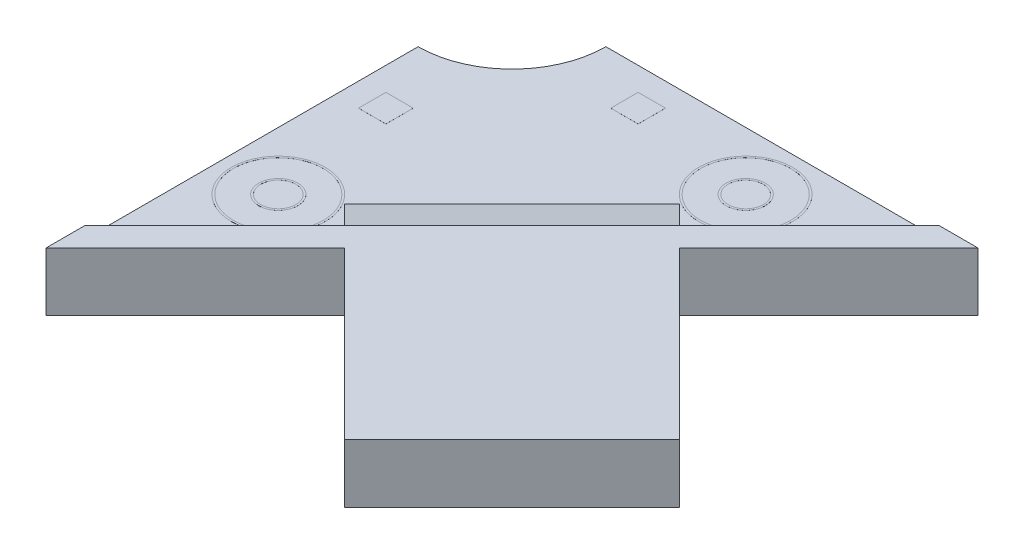
ISO-10303-21;
HEADER;
FILE_DESCRIPTION(('STEP AP214'),'2;1');
FILE_NAME('part.step','',(''),(''),'','','');
FILE_SCHEMA(('AUTOMOTIVE_DESIGN { 1 0 10303 214 1 1 1 1 }'));
ENDSEC;
DATA;
#1=APPLICATION_CONTEXT('core data for automotive mechanical design processes');
#2=APPLICATION_PROTOCOL_DEFINITION('international standard','automotive_design',2000,#1);
#3=PRODUCT_CONTEXT('',#1,'mechanical');
#4=PRODUCT('Part','Part','',(#3));
#5=PRODUCT_RELATED_PRODUCT_CATEGORY('part','',(#4));
#6=PRODUCT_DEFINITION_FORMATION('','',#4);
#7=PRODUCT_DEFINITION_CONTEXT('part definition',#1,'design');
#8=PRODUCT_DEFINITION('design','',#6,#7);
#9=PRODUCT_DEFINITION_SHAPE('','',#8);
#10=(LENGTH_UNIT() NAMED_UNIT(*) SI_UNIT(.MILLI.,.METRE.));
#11=(NAMED_UNIT(*) PLANE_ANGLE_UNIT() SI_UNIT($,.RADIAN.));
#12=(NAMED_UNIT(*) SI_UNIT($,.STERADIAN.) SOLID_ANGLE_UNIT());
#13=UNCERTAINTY_MEASURE_WITH_UNIT(LENGTH_MEASURE(1.E-05),#10,'distance_accuracy_value','');
#14=(GEOMETRIC_REPRESENTATION_CONTEXT(3) GLOBAL_UNCERTAINTY_ASSIGNED_CONTEXT((#13)) GLOBAL_UNIT_ASSIGNED_CONTEXT((#10,
#11,#12)) REPRESENTATION_CONTEXT('',''));
#15=CARTESIAN_POINT('',(0.,0.,0.));
#16=DIRECTION('',(0.,0.,1.));
#17=DIRECTION('',(1.,0.,0.));
#18=AXIS2_PLACEMENT_3D('',#15,#16,#17);
#19=CARTESIAN_POINT('',(0.,152.4,0.));
#20=DIRECTION('',(0.,1.,0.));
#21=DIRECTION('',(0.,0.,1.));
#22=AXIS2_PLACEMENT_3D('',#19,#20,#21);
#23=PLANE('',#22);
#24=DIRECTION('',(0.,0.,1.));
#25=VECTOR('',#24,1.);
#26=CARTESIAN_POINT('',(165.099999999991,152.4,-5.15460690004508E-13));
#27=LINE('',#26,#25);
#28=CARTESIAN_POINT('',(165.099999999992,152.4,485.749570705175));
#29=VERTEX_POINT('',#28);
#30=CARTESIAN_POINT('',(165.099999999993,152.4,574.649570705175));
#31=VERTEX_POINT('',#30);
#32=EDGE_CURVE('E253',#29,#31,#27,.T.);
#33=ORIENTED_EDGE('',*,*,#32,.T.);
#34=DIRECTION('',(-1.,0.,0.));
#35=VECTOR('',#34,1.);
#36=CARTESIAN_POINT('',(2.15294437959904E-12,152.4,574.649570705176));
#37=LINE('',#36,#35);
#38=CARTESIAN_POINT('',(76.1999999999927,152.4,574.649570705175));
#39=VERTEX_POINT('',#38);
#40=EDGE_CURVE('E244',#31,#39,#37,.T.);
#41=ORIENTED_EDGE('',*,*,#40,.T.);
#42=DIRECTION('',(0.,0.,1.));
#43=VECTOR('',#42,1.);
#44=CARTESIAN_POINT('',(76.1999999999905,152.4,-2.85485920617862E-13));
#45=LINE('',#44,#43);
#46=CARTESIAN_POINT('',(76.1999999999923,152.4,485.749570705175));
#47=VERTEX_POINT('',#46);
#48=EDGE_CURVE('E246',#47,#39,#45,.T.);
#49=ORIENTED_EDGE('',*,*,#48,.F.);
#50=DIRECTION('',(-1.,0.,0.));
#51=VECTOR('',#50,1.);
#52=CARTESIAN_POINT('',(2.42650329628199E-12,152.4,485.749570705176));
#53=LINE('',#52,#51);
#54=EDGE_CURVE('E250',#29,#47,#53,.T.);
#55=ORIENTED_EDGE('',*,*,#54,.F.);
#56=EDGE_LOOP('',(#33,#41,#49,#55));
#57=FACE_BOUND('',#56,.T.);
#58=CARTESIAN_POINT('',(188.585378542446,152.4,947.417020772786));
#59=DIRECTION('',(0.,1.,0.));
#60=DIRECTION('',(0.,0.,1.));
#61=AXIS2_PLACEMENT_3D('',#58,#59,#60);
#62=CIRCLE('',#61,152.4);
#63=CARTESIAN_POINT('',(188.585378542446,152.4,1099.81702077279));
#64=VERTEX_POINT('',#63);
#65=EDGE_CURVE('E67',#64,#64,#62,.T.);
#66=ORIENTED_EDGE('',*,*,#65,.F.);
#67=EDGE_LOOP('',(#66));
#68=FACE_BOUND('',#67,.T.);
#69=CARTESIAN_POINT('',(947.417020772787,152.4,188.585378542443));
#70=DIRECTION('',(0.,1.,0.));
#71=DIRECTION('',(0.,0.,1.));
#72=AXIS2_PLACEMENT_3D('',#69,#70,#71);
#73=CIRCLE('',#72,152.400000000001);
#74=CARTESIAN_POINT('',(947.417020772787,152.4,340.985378542443));
#75=VERTEX_POINT('',#74);
#76=EDGE_CURVE('E285',#75,#75,#73,.T.);
#77=ORIENTED_EDGE('',*,*,#76,.F.);
#78=EDGE_LOOP('',(#77));
#79=FACE_BOUND('',#78,.T.);
#80=DIRECTION('',(0.707106781186548,0.,0.707106781186547));
#81=VECTOR('',#80,1.);
#82=CARTESIAN_POINT('',(866.594715683168,152.4,323.289220358482));
#83=LINE('',#82,#81);
#84=CARTESIAN_POINT('',(866.594715683168,152.4,323.289220358482));
#85=VERTEX_POINT('',#84);
#86=CARTESIAN_POINT('',(965.377533014928,152.4,422.072037690242));
#87=VERTEX_POINT('',#86);
#88=EDGE_CURVE('E306',#85,#87,#83,.T.);
#89=ORIENTED_EDGE('',*,*,#88,.T.);
#90=DIRECTION('',(-0.707106781186546,0.,0.707106781186549));
#91=VECTOR('',#90,1.);
#92=CARTESIAN_POINT('',(1387.44957070518,152.4,-1.05178150895727E-11));
#93=LINE('',#92,#91);
#94=CARTESIAN_POINT('',(1387.44957070518,152.4,-9.6406466049164E-12));
#95=VERTEX_POINT('',#94);
#96=EDGE_CURVE('E348',#95,#87,#93,.T.);
#97=ORIENTED_EDGE('',*,*,#96,.F.);
#98=DIRECTION('',(-1.,0.,0.));
#99=VECTOR('',#98,1.);
#100=CARTESIAN_POINT('',(1513.17315640014,152.4,-1.05182352380585E-11));
#101=LINE('',#100,#99);
#102=CARTESIAN_POINT('',(304.8,152.4,-1.08628629570571E-11));
#103=VERTEX_POINT('',#102);
#104=EDGE_CURVE('E378',#95,#103,#101,.T.);
#105=ORIENTED_EDGE('',*,*,#104,.T.);
#106=CARTESIAN_POINT('',(0.,152.4,0.));
#107=DIRECTION('',(0.,1.,0.));
#108=DIRECTION('',(0.,0.,-1.));
#109=AXIS2_PLACEMENT_3D('',#106,#107,#108);
#110=CIRCLE('',#109,304.8);
#111=CARTESIAN_POINT('',(0.,152.4,304.8));
#112=VERTEX_POINT('',#111);
#113=EDGE_CURVE('E366',#112,#103,#110,.T.);
#114=ORIENTED_EDGE('',*,*,#113,.F.);
#115=DIRECTION('',(0.,0.,1.));
#116=VECTOR('',#115,1.);
#117=CARTESIAN_POINT('',(0.,152.4,0.));
#118=LINE('',#117,#116);
#119=CARTESIAN_POINT('',(0.,152.4,1387.44957070517));
#120=VERTEX_POINT('',#119);
#121=EDGE_CURVE('E380',#112,#120,#118,.T.);
#122=ORIENTED_EDGE('',*,*,#121,.T.);
#123=CARTESIAN_POINT('',(422.072037690245,152.4,965.377533014926));
#124=VERTEX_POINT('',#123);
#125=EDGE_CURVE('E343',#124,#120,#93,.T.);
#126=ORIENTED_EDGE('',*,*,#125,.F.);
#127=DIRECTION('',(0.707106781186548,0.,0.707106781186547));
#128=VECTOR('',#127,1.);
#129=CARTESIAN_POINT('',(323.289220358484,152.4,866.594715683165));
#130=LINE('',#129,#128);
#131=CARTESIAN_POINT('',(323.289220358484,152.4,866.594715683165));
#132=VERTEX_POINT('',#131);
#133=EDGE_CURVE('E304',#132,#124,#130,.T.);
#134=ORIENTED_EDGE('',*,*,#133,.F.);
#135=DIRECTION('',(-0.707106781186548,0.,0.707106781186548));
#136=VECTOR('',#135,1.);
#137=CARTESIAN_POINT('',(866.594715683168,152.4,323.289220358482));
#138=LINE('',#137,#136);
#139=EDGE_CURVE('E315',#85,#132,#138,.T.);
#140=ORIENTED_EDGE('',*,*,#139,.F.);
#141=EDGE_LOOP('',(#89,#97,#105,#114,#122,#126,#134,#140));
#142=FACE_BOUND('',#141,.T.);
#143=DIRECTION('',(0.,0.,-1.));
#144=VECTOR('',#143,1.);
#145=CARTESIAN_POINT('',(574.649570705175,152.4,-7.17648126533012E-13));
#146=LINE('',#145,#144);
#147=CARTESIAN_POINT('',(574.649570705176,152.4,165.09999999999));
#148=VERTEX_POINT('',#147);
#149=CARTESIAN_POINT('',(574.649570705176,152.4,76.1999999999903));
#150=VERTEX_POINT('',#149);
#151=EDGE_CURVE('E74',#148,#150,#146,.T.);
#152=ORIENTED_EDGE('',*,*,#151,.F.);
#153=DIRECTION('',(1.,0.,0.));
#154=VECTOR('',#153,1.);
#155=CARTESIAN_POINT('',(0.,152.4,165.09999999999));
#156=LINE('',#155,#154);
#157=CARTESIAN_POINT('',(485.749570705176,152.4,165.09999999999));
#158=VERTEX_POINT('',#157);
#159=EDGE_CURVE('E199',#158,#148,#156,.T.);
#160=ORIENTED_EDGE('',*,*,#159,.F.);
#161=DIRECTION('',(0.,0.,-1.));
#162=VECTOR('',#161,1.);
#163=CARTESIAN_POINT('',(485.749570705176,152.4,3.03312912035248E-13));
#164=LINE('',#163,#162);
#165=CARTESIAN_POINT('',(485.749570705176,152.4,76.1999999999903));
#166=VERTEX_POINT('',#165);
#167=EDGE_CURVE('E202',#158,#166,#164,.T.);
#168=ORIENTED_EDGE('',*,*,#167,.T.);
#169=DIRECTION('',(1.,0.,0.));
#170=VECTOR('',#169,1.);
#171=CARTESIAN_POINT('',(0.,152.4,76.1999999999903));
#172=LINE('',#171,#170);
#173=EDGE_CURVE('E79',#166,#150,#172,.T.);
#174=ORIENTED_EDGE('',*,*,#173,.T.);
#175=EDGE_LOOP('',(#152,#160,#168,#174));
#176=FACE_BOUND('',#175,.T.);
#177=ADVANCED_FACE('F59',(#57,#68,#79,#142,#176),#23,.T.);
#178=CARTESIAN_POINT('',(1387.44957070518,190.5,-1.05178150895727E-11));
#179=DIRECTION('',(0.707106781186549,0.,0.707106781186546));
#180=DIRECTION('',(0.707106781186546,0.,-0.707106781186549));
#181=AXIS2_PLACEMENT_3D('',#178,#179,#180);
#182=PLANE('',#181);
#183=DIRECTION('',(0.,1.,0.));
#184=VECTOR('',#183,1.);
#185=CARTESIAN_POINT('',(422.072037690245,152.4,965.377533014926));
#186=LINE('',#185,#184);
#187=CARTESIAN_POINT('',(422.072037690244,190.5,965.377533014925));
#188=VERTEX_POINT('',#187);
#189=EDGE_CURVE('E297',#124,#188,#186,.T.);
#190=ORIENTED_EDGE('',*,*,#189,.F.);
#191=ORIENTED_EDGE('',*,*,#125,.T.);
#192=DIRECTION('',(0.,-1.,0.));
#193=VECTOR('',#192,1.);
#194=CARTESIAN_POINT('',(0.,190.5,1387.44957070517));
#195=LINE('',#194,#193);
#196=CARTESIAN_POINT('',(0.,190.5,1387.44957070517));
#197=VERTEX_POINT('',#196);
#198=EDGE_CURVE('E358',#197,#120,#195,.T.);
#199=ORIENTED_EDGE('',*,*,#198,.F.);
#200=DIRECTION('',(-0.707106781186546,0.,0.707106781186549));
#201=VECTOR('',#200,1.);
#202=CARTESIAN_POINT('',(1387.44957070518,190.5,-1.05178150895727E-11));
#203=LINE('',#202,#201);
#204=EDGE_CURVE('E354',#188,#197,#203,.T.);
#205=ORIENTED_EDGE('',*,*,#204,.F.);
#206=EDGE_LOOP('',(#190,#191,#199,#205));
#207=FACE_BOUND('',#206,.T.);
#208=ADVANCED_FACE('F409',(#207),#182,.F.);
#209=CARTESIAN_POINT('',(-5.28321583800946E-12,152.4,1513.17315640014));
#210=DIRECTION('',(-0.707106781186549,0.,-0.707106781186546));
#211=DIRECTION('',(-0.707106781186546,0.,0.707106781186549));
#212=AXIS2_PLACEMENT_3D('',#209,#210,#211);
#213=PLANE('',#212);
#214=DIRECTION('',(0.,-1.,0.));
#215=VECTOR('',#214,1.);
#216=CARTESIAN_POINT('',(1028.23932586241,190.5,484.933830537726));
#217=LINE('',#216,#215);
#218=CARTESIAN_POINT('',(1028.23932586241,190.5,484.933830537725));
#219=VERTEX_POINT('',#218);
#220=CARTESIAN_POINT('',(1028.23932586241,0.,484.933830537726));
#221=VERTEX_POINT('',#220);
#222=EDGE_CURVE('E340',#219,#221,#217,.T.);
#223=ORIENTED_EDGE('',*,*,#222,.T.);
#224=DIRECTION('',(0.707106781186546,0.,-0.707106781186549));
#225=VECTOR('',#224,1.);
#226=CARTESIAN_POINT('',(-5.28321583800946E-12,0.,1513.17315640014));
#227=LINE('',#226,#225);
#228=CARTESIAN_POINT('',(1513.17315640014,0.,-1.05182352380585E-11));
#229=VERTEX_POINT('',#228);
#230=EDGE_CURVE('E389',#221,#229,#227,.T.);
#231=ORIENTED_EDGE('',*,*,#230,.T.);
#232=DIRECTION('',(0.,-1.,0.));
#233=VECTOR('',#232,1.);
#234=CARTESIAN_POINT('',(1513.17315640014,152.4,-1.05182352380585E-11));
#235=LINE('',#234,#233);
#236=CARTESIAN_POINT('',(1513.17315640014,190.5,-1.05182352380585E-11));
#237=VERTEX_POINT('',#236);
#238=EDGE_CURVE('E384',#237,#229,#235,.T.);
#239=ORIENTED_EDGE('',*,*,#238,.F.);
#240=DIRECTION('',(0.707106781186546,0.,-0.707106781186549));
#241=VECTOR('',#240,1.);
#242=CARTESIAN_POINT('',(-5.28321583800946E-12,190.5,1513.17315640014));
#243=LINE('',#242,#241);
#244=EDGE_CURVE('E347',#219,#237,#243,.T.);
#245=ORIENTED_EDGE('',*,*,#244,.F.);
#246=EDGE_LOOP('',(#223,#231,#239,#245));
#247=FACE_BOUND('',#246,.T.);
#248=ADVANCED_FACE('F492',(#247),#213,.F.);
#249=DIRECTION('',(0.,-1.,0.));
#250=VECTOR('',#249,1.);
#251=CARTESIAN_POINT('',(484.933830537729,190.5,1028.23932586241));
#252=LINE('',#251,#250);
#253=CARTESIAN_POINT('',(484.933830537729,190.5,1028.23932586241));
#254=VERTEX_POINT('',#253);
#255=CARTESIAN_POINT('',(484.933830537729,0.,1028.23932586241));
#256=VERTEX_POINT('',#255);
#257=EDGE_CURVE('E338',#254,#256,#252,.T.);
#258=ORIENTED_EDGE('',*,*,#257,.F.);
#259=CARTESIAN_POINT('',(-5.28321583800946E-12,190.5,1513.17315640014));
#260=VERTEX_POINT('',#259);
#261=EDGE_CURVE('E349',#260,#254,#243,.T.);
#262=ORIENTED_EDGE('',*,*,#261,.F.);
#263=DIRECTION('',(0.,-1.,0.));
#264=VECTOR('',#263,1.);
#265=CARTESIAN_POINT('',(-5.28321583800946E-12,152.4,1513.17315640014));
#266=LINE('',#265,#264);
#267=CARTESIAN_POINT('',(-5.28321583800946E-12,0.,1513.17315640014));
#268=VERTEX_POINT('',#267);
#269=EDGE_CURVE('E394',#260,#268,#266,.T.);
#270=ORIENTED_EDGE('',*,*,#269,.T.);
#271=EDGE_CURVE('E381',#268,#256,#227,.T.);
#272=ORIENTED_EDGE('',*,*,#271,.T.);
#273=EDGE_LOOP('',(#258,#262,#270,#272));
#274=FACE_BOUND('',#273,.T.);
#275=ADVANCED_FACE('F444',(#274),#213,.F.);
#276=CARTESIAN_POINT('',(1513.17315640014,152.4,-1.05182352380585E-11));
#277=DIRECTION('',(0.,0.,1.));
#278=DIRECTION('',(1.,0.,0.));
#279=AXIS2_PLACEMENT_3D('',#276,#277,#278);
#280=PLANE('',#279);
#281=DIRECTION('',(-1.,0.,0.));
#282=VECTOR('',#281,1.);
#283=CARTESIAN_POINT('',(1513.17315640014,0.,-1.05182352380585E-11));
#284=LINE('',#283,#282);
#285=CARTESIAN_POINT('',(304.8,0.,-2.11869876689278E-12));
#286=VERTEX_POINT('',#285);
#287=EDGE_CURVE('E376',#229,#286,#284,.T.);
#288=ORIENTED_EDGE('',*,*,#287,.T.);
#289=DIRECTION('',(0.,1.,0.));
#290=VECTOR('',#289,1.);
#291=CARTESIAN_POINT('',(304.8,0.,-1.08628629570571E-11));
#292=LINE('',#291,#290);
#293=EDGE_CURVE('E373',#286,#103,#292,.T.);
#294=ORIENTED_EDGE('',*,*,#293,.T.);
#295=ORIENTED_EDGE('',*,*,#104,.F.);
#296=DIRECTION('',(0.,-1.,0.));
#297=VECTOR('',#296,1.);
#298=CARTESIAN_POINT('',(1387.44957070518,190.5,-1.05178150895727E-11));
#299=LINE('',#298,#297);
#300=CARTESIAN_POINT('',(1387.44957070518,190.5,-1.05178150895727E-11));
#301=VERTEX_POINT('',#300);
#302=EDGE_CURVE('E363',#301,#95,#299,.T.);
#303=ORIENTED_EDGE('',*,*,#302,.F.);
#304=DIRECTION('',(-1.,0.,0.));
#305=VECTOR('',#304,1.);
#306=CARTESIAN_POINT('',(1387.44957070518,190.5,-1.05178150895727E-11));
#307=LINE('',#306,#305);
#308=EDGE_CURVE('E352',#237,#301,#307,.T.);
#309=ORIENTED_EDGE('',*,*,#308,.F.);
#310=ORIENTED_EDGE('',*,*,#238,.T.);
#311=EDGE_LOOP('',(#288,#294,#295,#303,#309,#310));
#312=FACE_BOUND('',#311,.T.);
#313=ADVANCED_FACE('F61',(#312),#280,.F.);
#314=CARTESIAN_POINT('',(0.,152.4,0.));
#315=DIRECTION('',(1.,0.,0.));
#316=DIRECTION('',(0.,0.,-1.));
#317=AXIS2_PLACEMENT_3D('',#314,#315,#316);
#318=PLANE('',#317);
#319=ORIENTED_EDGE('',*,*,#121,.F.);
#320=DIRECTION('',(0.,1.,0.));
#321=VECTOR('',#320,1.);
#322=CARTESIAN_POINT('',(0.,0.,304.8));
#323=LINE('',#322,#321);
#324=CARTESIAN_POINT('',(0.,0.,304.8));
#325=VERTEX_POINT('',#324);
#326=EDGE_CURVE('E370',#325,#112,#323,.T.);
#327=ORIENTED_EDGE('',*,*,#326,.F.);
#328=DIRECTION('',(0.,0.,1.));
#329=VECTOR('',#328,1.);
#330=CARTESIAN_POINT('',(0.,0.,0.));
#331=LINE('',#330,#329);
#332=EDGE_CURVE('E387',#325,#268,#331,.T.);
#333=ORIENTED_EDGE('',*,*,#332,.T.);
#334=ORIENTED_EDGE('',*,*,#269,.F.);
#335=DIRECTION('',(0.,0.,1.));
#336=VECTOR('',#335,1.);
#337=CARTESIAN_POINT('',(0.,190.5,1387.44957070517));
#338=LINE('',#337,#336);
#339=EDGE_CURVE('E344',#197,#260,#338,.T.);
#340=ORIENTED_EDGE('',*,*,#339,.F.);
#341=ORIENTED_EDGE('',*,*,#198,.T.);
#342=EDGE_LOOP('',(#319,#327,#333,#334,#340,#341));
#343=FACE_BOUND('',#342,.T.);
#344=ADVANCED_FACE('F435',(#343),#318,.F.);
#345=CARTESIAN_POINT('',(0.,0.,0.));
#346=DIRECTION('',(0.,1.,0.));
#347=DIRECTION('',(0.,0.,1.));
#348=AXIS2_PLACEMENT_3D('',#345,#346,#347);
#349=PLANE('',#348);
#350=ORIENTED_EDGE('',*,*,#332,.F.);
#351=CARTESIAN_POINT('',(0.,0.,0.));
#352=DIRECTION('',(0.,1.,0.));
#353=DIRECTION('',(0.,0.,-1.));
#354=AXIS2_PLACEMENT_3D('',#351,#352,#353);
#355=CIRCLE('',#354,304.8);
#356=EDGE_CURVE('E367',#325,#286,#355,.T.);
#357=ORIENTED_EDGE('',*,*,#356,.T.);
#358=ORIENTED_EDGE('',*,*,#287,.F.);
#359=ORIENTED_EDGE('',*,*,#230,.F.);
#360=DIRECTION('',(-0.707106781186552,0.,-0.707106781186543));
#361=VECTOR('',#360,1.);
#362=CARTESIAN_POINT('',(1567.05469312657,0.,1023.74919780187));
#363=LINE('',#362,#361);
#364=CARTESIAN_POINT('',(1567.05469312657,0.,1023.74919780187));
#365=VERTEX_POINT('',#364);
#366=EDGE_CURVE('E317',#365,#221,#363,.T.);
#367=ORIENTED_EDGE('',*,*,#366,.F.);
#368=DIRECTION('',(0.707106781186547,0.,-0.707106781186548));
#369=VECTOR('',#368,1.);
#370=CARTESIAN_POINT('',(1023.74919780188,0.,1567.05469312656));
#371=LINE('',#370,#369);
#372=CARTESIAN_POINT('',(1023.74919780188,0.,1567.05469312656));
#373=VERTEX_POINT('',#372);
#374=EDGE_CURVE('E324',#373,#365,#371,.T.);
#375=ORIENTED_EDGE('',*,*,#374,.F.);
#376=DIRECTION('',(0.707106781186548,0.,0.707106781186547));
#377=VECTOR('',#376,1.);
#378=CARTESIAN_POINT('',(484.933830537729,0.,1028.23932586241));
#379=LINE('',#378,#377);
#380=EDGE_CURVE('E330',#256,#373,#379,.T.);
#381=ORIENTED_EDGE('',*,*,#380,.F.);
#382=ORIENTED_EDGE('',*,*,#271,.F.);
#383=EDGE_LOOP('',(#350,#357,#358,#359,#367,#375,#381,#382));
#384=FACE_BOUND('',#383,.T.);
#385=ADVANCED_FACE('F438',(#384),#349,.F.);
#386=CARTESIAN_POINT('',(0.,0.,0.));
#387=DIRECTION('',(0.,1.,0.));
#388=DIRECTION('',(0.,0.,1.));
#389=AXIS2_PLACEMENT_3D('',#386,#387,#388);
#390=CYLINDRICAL_SURFACE('',#389,304.8);
#391=ORIENTED_EDGE('',*,*,#113,.T.);
#392=ORIENTED_EDGE('',*,*,#293,.F.);
#393=ORIENTED_EDGE('',*,*,#356,.F.);
#394=ORIENTED_EDGE('',*,*,#326,.T.);
#395=EDGE_LOOP('',(#391,#392,#393,#394));
#396=FACE_BOUND('',#395,.T.);
#397=ADVANCED_FACE('F431',(#396),#390,.F.);
#398=ORIENTED_EDGE('',*,*,#96,.T.);
#399=DIRECTION('',(0.,1.,0.));
#400=VECTOR('',#399,1.);
#401=CARTESIAN_POINT('',(965.377533014928,152.4,422.072037690242));
#402=LINE('',#401,#400);
#403=CARTESIAN_POINT('',(965.377533014928,190.5,422.072037690242));
#404=VERTEX_POINT('',#403);
#405=EDGE_CURVE('E300',#87,#404,#402,.T.);
#406=ORIENTED_EDGE('',*,*,#405,.T.);
#407=EDGE_CURVE('E355',#301,#404,#203,.T.);
#408=ORIENTED_EDGE('',*,*,#407,.F.);
#409=ORIENTED_EDGE('',*,*,#302,.T.);
#410=EDGE_LOOP('',(#398,#406,#408,#409));
#411=FACE_BOUND('',#410,.T.);
#412=ADVANCED_FACE('F423',(#411),#182,.F.);
#413=CARTESIAN_POINT('',(0.,190.5,0.));
#414=DIRECTION('',(0.,1.,0.));
#415=DIRECTION('',(0.,0.,1.));
#416=AXIS2_PLACEMENT_3D('',#413,#414,#415);
#417=PLANE('',#416);
#418=ORIENTED_EDGE('',*,*,#339,.T.);
#419=ORIENTED_EDGE('',*,*,#261,.T.);
#420=DIRECTION('',(0.707106781186548,0.,0.707106781186547));
#421=VECTOR('',#420,1.);
#422=CARTESIAN_POINT('',(484.933830537729,190.5,1028.23932586241));
#423=LINE('',#422,#421);
#424=CARTESIAN_POINT('',(1023.74919780188,190.5,1567.05469312656));
#425=VERTEX_POINT('',#424);
#426=EDGE_CURVE('E323',#254,#425,#423,.T.);
#427=ORIENTED_EDGE('',*,*,#426,.T.);
#428=DIRECTION('',(0.707106781186547,0.,-0.707106781186548));
#429=VECTOR('',#428,1.);
#430=CARTESIAN_POINT('',(1023.74919780188,190.5,1567.05469312656));
#431=LINE('',#430,#429);
#432=CARTESIAN_POINT('',(1567.05469312657,190.5,1023.74919780187));
#433=VERTEX_POINT('',#432);
#434=EDGE_CURVE('E326',#425,#433,#431,.T.);
#435=ORIENTED_EDGE('',*,*,#434,.T.);
#436=DIRECTION('',(-0.707106781186552,0.,-0.707106781186543));
#437=VECTOR('',#436,1.);
#438=CARTESIAN_POINT('',(1567.05469312657,190.5,1023.74919780187));
#439=LINE('',#438,#437);
#440=EDGE_CURVE('E320',#433,#219,#439,.T.);
#441=ORIENTED_EDGE('',*,*,#440,.T.);
#442=ORIENTED_EDGE('',*,*,#244,.T.);
#443=ORIENTED_EDGE('',*,*,#308,.T.);
#444=ORIENTED_EDGE('',*,*,#407,.T.);
#445=DIRECTION('',(-0.707106781186548,0.,0.707106781186548));
#446=VECTOR('',#445,1.);
#447=CARTESIAN_POINT('',(965.377533014928,190.5,422.072037690242));
#448=LINE('',#447,#446);
#449=EDGE_CURVE('E309',#404,#188,#448,.T.);
#450=ORIENTED_EDGE('',*,*,#449,.T.);
#451=ORIENTED_EDGE('',*,*,#204,.T.);
#452=EDGE_LOOP('',(#418,#419,#427,#435,#441,#442,#443,#444,#450,#451));
#453=FACE_BOUND('',#452,.T.);
#454=ADVANCED_FACE('F449',(#453),#417,.T.);
#455=CARTESIAN_POINT('',(1567.05469312657,190.5,1023.74919780187));
#456=DIRECTION('',(-0.707106781186543,0.,0.707106781186552));
#457=DIRECTION('',(0.707106781186552,0.,0.707106781186543));
#458=AXIS2_PLACEMENT_3D('',#455,#456,#457);
#459=PLANE('',#458);
#460=ORIENTED_EDGE('',*,*,#366,.T.);
#461=ORIENTED_EDGE('',*,*,#222,.F.);
#462=ORIENTED_EDGE('',*,*,#440,.F.);
#463=DIRECTION('',(0.,-1.,0.));
#464=VECTOR('',#463,1.);
#465=CARTESIAN_POINT('',(1567.05469312657,190.5,1023.74919780187));
#466=LINE('',#465,#464);
#467=EDGE_CURVE('E328',#433,#365,#466,.T.);
#468=ORIENTED_EDGE('',*,*,#467,.T.);
#469=EDGE_LOOP('',(#460,#461,#462,#468));
#470=FACE_BOUND('',#469,.T.);
#471=ADVANCED_FACE('F479',(#470),#459,.F.);
#472=CARTESIAN_POINT('',(484.933830537729,190.5,1028.23932586241));
#473=DIRECTION('',(0.707106781186547,0.,-0.707106781186548));
#474=DIRECTION('',(-0.707106781186548,0.,-0.707106781186547));
#475=AXIS2_PLACEMENT_3D('',#472,#473,#474);
#476=PLANE('',#475);
#477=ORIENTED_EDGE('',*,*,#380,.T.);
#478=DIRECTION('',(0.,-1.,0.));
#479=VECTOR('',#478,1.);
#480=CARTESIAN_POINT('',(1023.74919780188,190.5,1567.05469312656));
#481=LINE('',#480,#479);
#482=EDGE_CURVE('E335',#425,#373,#481,.T.);
#483=ORIENTED_EDGE('',*,*,#482,.F.);
#484=ORIENTED_EDGE('',*,*,#426,.F.);
#485=ORIENTED_EDGE('',*,*,#257,.T.);
#486=EDGE_LOOP('',(#477,#483,#484,#485));
#487=FACE_BOUND('',#486,.T.);
#488=ADVANCED_FACE('F475',(#487),#476,.F.);
#489=CARTESIAN_POINT('',(1023.74919780188,190.5,1567.05469312656));
#490=DIRECTION('',(-0.707106781186548,0.,-0.707106781186547));
#491=DIRECTION('',(-0.707106781186547,0.,0.707106781186548));
#492=AXIS2_PLACEMENT_3D('',#489,#490,#491);
#493=PLANE('',#492);
#494=ORIENTED_EDGE('',*,*,#374,.T.);
#495=ORIENTED_EDGE('',*,*,#467,.F.);
#496=ORIENTED_EDGE('',*,*,#434,.F.);
#497=ORIENTED_EDGE('',*,*,#482,.T.);
#498=EDGE_LOOP('',(#494,#495,#496,#497));
#499=FACE_BOUND('',#498,.T.);
#500=ADVANCED_FACE('F468',(#499),#493,.F.);
#501=CARTESIAN_POINT('',(965.377533014928,190.5,422.072037690242));
#502=DIRECTION('',(-0.186052101883813,0.964763821237732,-0.186052101883813));
#503=DIRECTION('',(0.,0.189358320929341,0.981908053890394));
#504=AXIS2_PLACEMENT_3D('',#501,#502,#503);
#505=PLANE('',#504);
#506=DIRECTION('',(-0.682191040240647,-0.263117405792109,-0.682191040240646));
#507=VECTOR('',#506,1.);
#508=CARTESIAN_POINT('',(422.072037690245,190.5,965.377533014926));
#509=LINE('',#508,#507);
#510=EDGE_CURVE('E311',#188,#132,#509,.T.);
#511=ORIENTED_EDGE('',*,*,#510,.F.);
#512=ORIENTED_EDGE('',*,*,#449,.F.);
#513=DIRECTION('',(-0.682191040240647,-0.263117405792109,-0.682191040240646));
#514=VECTOR('',#513,1.);
#515=CARTESIAN_POINT('',(965.377533014928,190.5,422.072037690242));
#516=LINE('',#515,#514);
#517=EDGE_CURVE('E303',#404,#85,#516,.T.);
#518=ORIENTED_EDGE('',*,*,#517,.T.);
#519=ORIENTED_EDGE('',*,*,#139,.T.);
#520=EDGE_LOOP('',(#511,#512,#518,#519));
#521=FACE_BOUND('',#520,.T.);
#522=ADVANCED_FACE('F458',(#521),#505,.T.);
#523=CARTESIAN_POINT('',(271.652747662343,0.,-271.652747662343));
#524=DIRECTION('',(0.707106781186547,0.,-0.707106781186548));
#525=DIRECTION('',(-0.707106781186548,0.,-0.707106781186547));
#526=AXIS2_PLACEMENT_3D('',#523,#524,#525);
#527=PLANE('',#526);
#528=ORIENTED_EDGE('',*,*,#405,.F.);
#529=ORIENTED_EDGE('',*,*,#88,.F.);
#530=ORIENTED_EDGE('',*,*,#517,.F.);
#531=EDGE_LOOP('',(#528,#529,#530));
#532=FACE_BOUND('',#531,.T.);
#533=ADVANCED_FACE('F459',(#532),#527,.T.);
#534=CARTESIAN_POINT('',(-271.652747662341,0.,271.652747662341));
#535=DIRECTION('',(0.707106781186547,0.,-0.707106781186548));
#536=DIRECTION('',(-0.707106781186548,0.,-0.707106781186547));
#537=AXIS2_PLACEMENT_3D('',#534,#535,#536);
#538=PLANE('',#537);
#539=ORIENTED_EDGE('',*,*,#189,.T.);
#540=ORIENTED_EDGE('',*,*,#510,.T.);
#541=ORIENTED_EDGE('',*,*,#133,.T.);
#542=EDGE_LOOP('',(#539,#540,#541));
#543=FACE_BOUND('',#542,.T.);
#544=ADVANCED_FACE('F455',(#543),#538,.F.);
#545=CARTESIAN_POINT('',(947.417020772787,152.527,188.585378542443));
#546=DIRECTION('',(0.,-1.,0.));
#547=DIRECTION('',(0.,0.,-1.));
#548=AXIS2_PLACEMENT_3D('',#545,#546,#547);
#549=CYLINDRICAL_SURFACE('',#548,146.049999999999);
#550=CARTESIAN_POINT('',(947.417020772787,152.527,188.585378542443));
#551=DIRECTION('',(0.,1.,0.));
#552=DIRECTION('',(0.,0.,1.));
#553=AXIS2_PLACEMENT_3D('',#550,#551,#552);
#554=CIRCLE('',#553,146.049999999999);
#555=CARTESIAN_POINT('',(947.417020772787,152.527,334.635378542442));
#556=VERTEX_POINT('',#555);
#557=EDGE_CURVE('E291',#556,#556,#554,.T.);
#558=ORIENTED_EDGE('',*,*,#557,.T.);
#559=EDGE_LOOP('',(#558));
#560=FACE_BOUND('',#559,.T.);
#561=CARTESIAN_POINT('',(947.417020772787,152.4,188.585378542443));
#562=DIRECTION('',(0.,1.,0.));
#563=DIRECTION('',(0.,0.,1.));
#564=AXIS2_PLACEMENT_3D('',#561,#562,#563);
#565=CIRCLE('',#564,146.049999999999);
#566=CARTESIAN_POINT('',(947.417020772787,152.4,334.635378542442));
#567=VERTEX_POINT('',#566);
#568=EDGE_CURVE('E397',#567,#567,#565,.F.);
#569=ORIENTED_EDGE('',*,*,#568,.T.);
#570=EDGE_LOOP('',(#569));
#571=FACE_BOUND('',#570,.T.);
#572=ADVANCED_FACE('F466',(#560,#571),#549,.F.);
#573=CARTESIAN_POINT('',(947.417020772787,152.527,188.585378542443));
#574=DIRECTION('',(0.,-1.,0.));
#575=DIRECTION('',(0.,0.,-1.));
#576=AXIS2_PLACEMENT_3D('',#573,#574,#575);
#577=CYLINDRICAL_SURFACE('',#576,152.400000000001);
#578=CARTESIAN_POINT('',(947.417020772787,152.527,188.585378542443));
#579=DIRECTION('',(0.,1.,0.));
#580=DIRECTION('',(0.,0.,1.));
#581=AXIS2_PLACEMENT_3D('',#578,#579,#580);
#582=CIRCLE('',#581,152.400000000001);
#583=CARTESIAN_POINT('',(947.417020772787,152.527,340.985378542443));
#584=VERTEX_POINT('',#583);
#585=EDGE_CURVE('E294',#584,#584,#582,.T.);
#586=ORIENTED_EDGE('',*,*,#585,.F.);
#587=EDGE_LOOP('',(#586));
#588=FACE_BOUND('',#587,.T.);
#589=ORIENTED_EDGE('',*,*,#76,.T.);
#590=EDGE_LOOP('',(#589));
#591=FACE_BOUND('',#590,.T.);
#592=ADVANCED_FACE('F610',(#588,#591),#577,.T.);
#593=CARTESIAN_POINT('',(0.,152.527,0.));
#594=DIRECTION('',(0.,1.,0.));
#595=DIRECTION('',(0.,0.,1.));
#596=AXIS2_PLACEMENT_3D('',#593,#594,#595);
#597=PLANE('',#596);
#598=ORIENTED_EDGE('',*,*,#557,.F.);
#599=EDGE_LOOP('',(#598));
#600=FACE_BOUND('',#599,.T.);
#601=ORIENTED_EDGE('',*,*,#585,.T.);
#602=EDGE_LOOP('',(#601));
#603=FACE_BOUND('',#602,.T.);
#604=ADVANCED_FACE('F565',(#600,#603),#597,.T.);
#605=CARTESIAN_POINT('',(947.417020772787,152.4,188.585378542443));
#606=DIRECTION('',(0.,1.,0.));
#607=DIRECTION('',(0.,0.,1.));
#608=AXIS2_PLACEMENT_3D('',#605,#606,#607);
#609=CIRCLE('',#608,63.4999999999999);
#610=CARTESIAN_POINT('',(947.417020772787,152.4,252.085378542442));
#611=VERTEX_POINT('',#610);
#612=EDGE_CURVE('E282',#611,#611,#609,.T.);
#613=ORIENTED_EDGE('',*,*,#612,.F.);
#614=EDGE_LOOP('',(#613));
#615=FACE_BOUND('',#614,.T.);
#616=ORIENTED_EDGE('',*,*,#568,.F.);
#617=EDGE_LOOP('',(#616));
#618=FACE_BOUND('',#617,.T.);
#619=ADVANCED_FACE('F413',(#615,#618),#23,.T.);
#620=CARTESIAN_POINT('',(947.417020772787,152.527,188.585378542443));
#621=DIRECTION('',(0.,-1.,0.));
#622=DIRECTION('',(0.,0.,-1.));
#623=AXIS2_PLACEMENT_3D('',#620,#621,#622);
#624=CYLINDRICAL_SURFACE('',#623,57.1500000000001);
#625=CARTESIAN_POINT('',(947.417020772787,152.527,188.585378542443));
#626=DIRECTION('',(0.,1.,0.));
#627=DIRECTION('',(0.,0.,1.));
#628=AXIS2_PLACEMENT_3D('',#625,#626,#627);
#629=CIRCLE('',#628,57.1500000000001);
#630=CARTESIAN_POINT('',(947.417020772787,152.527,245.735378542443));
#631=VERTEX_POINT('',#630);
#632=EDGE_CURVE('E286',#631,#631,#629,.T.);
#633=ORIENTED_EDGE('',*,*,#632,.T.);
#634=EDGE_LOOP('',(#633));
#635=FACE_BOUND('',#634,.T.);
#636=CARTESIAN_POINT('',(947.417020772787,152.4,188.585378542443));
#637=DIRECTION('',(0.,1.,0.));
#638=DIRECTION('',(0.,0.,1.));
#639=AXIS2_PLACEMENT_3D('',#636,#637,#638);
#640=CIRCLE('',#639,57.1500000000001);
#641=CARTESIAN_POINT('',(947.417020772787,152.4,245.735378542443));
#642=VERTEX_POINT('',#641);
#643=EDGE_CURVE('E400',#642,#642,#640,.F.);
#644=ORIENTED_EDGE('',*,*,#643,.T.);
#645=EDGE_LOOP('',(#644));
#646=FACE_BOUND('',#645,.T.);
#647=ADVANCED_FACE('F564',(#635,#646),#624,.F.);
#648=CARTESIAN_POINT('',(947.417020772787,152.527,188.585378542443));
#649=DIRECTION('',(0.,-1.,0.));
#650=DIRECTION('',(0.,0.,-1.));
#651=AXIS2_PLACEMENT_3D('',#648,#649,#650);
#652=CYLINDRICAL_SURFACE('',#651,63.4999999999999);
#653=CARTESIAN_POINT('',(947.417020772787,152.527,188.585378542443));
#654=DIRECTION('',(0.,1.,0.));
#655=DIRECTION('',(0.,0.,1.));
#656=AXIS2_PLACEMENT_3D('',#653,#654,#655);
#657=CIRCLE('',#656,63.4999999999999);
#658=CARTESIAN_POINT('',(947.417020772787,152.527,252.085378542442));
#659=VERTEX_POINT('',#658);
#660=EDGE_CURVE('E276',#659,#659,#657,.T.);
#661=ORIENTED_EDGE('',*,*,#660,.F.);
#662=EDGE_LOOP('',(#661));
#663=FACE_BOUND('',#662,.T.);
#664=ORIENTED_EDGE('',*,*,#612,.T.);
#665=EDGE_LOOP('',(#664));
#666=FACE_BOUND('',#665,.T.);
#667=ADVANCED_FACE('F636',(#663,#666),#652,.T.);
#668=CARTESIAN_POINT('',(0.,152.527,0.));
#669=DIRECTION('',(0.,1.,0.));
#670=DIRECTION('',(0.,0.,1.));
#671=AXIS2_PLACEMENT_3D('',#668,#669,#670);
#672=PLANE('',#671);
#673=ORIENTED_EDGE('',*,*,#632,.F.);
#674=EDGE_LOOP('',(#673));
#675=FACE_BOUND('',#674,.T.);
#676=ORIENTED_EDGE('',*,*,#660,.T.);
#677=EDGE_LOOP('',(#676));
#678=FACE_BOUND('',#677,.T.);
#679=ADVANCED_FACE('F575',(#675,#678),#672,.T.);
#680=ORIENTED_EDGE('',*,*,#643,.F.);
#681=EDGE_LOOP('',(#680));
#682=FACE_BOUND('',#681,.T.);
#683=ADVANCED_FACE('F567',(#682),#23,.T.);
#684=CARTESIAN_POINT('',(188.585378542446,152.527,947.417020772786));
#685=DIRECTION('',(0.,-1.,0.));
#686=DIRECTION('',(0.,0.,-1.));
#687=AXIS2_PLACEMENT_3D('',#684,#685,#686);
#688=CYLINDRICAL_SURFACE('',#687,152.4);
#689=CARTESIAN_POINT('',(188.585378542446,152.527,947.417020772786));
#690=DIRECTION('',(0.,1.,0.));
#691=DIRECTION('',(0.,0.,1.));
#692=AXIS2_PLACEMENT_3D('',#689,#690,#691);
#693=CIRCLE('',#692,152.4);
#694=CARTESIAN_POINT('',(188.585378542446,152.527,1099.81702077279));
#695=VERTEX_POINT('',#694);
#696=EDGE_CURVE('E277',#695,#695,#693,.F.);
#697=ORIENTED_EDGE('',*,*,#696,.T.);
#698=EDGE_LOOP('',(#697));
#699=FACE_BOUND('',#698,.T.);
#700=ORIENTED_EDGE('',*,*,#65,.T.);
#701=EDGE_LOOP('',(#700));
#702=FACE_BOUND('',#701,.T.);
#703=ADVANCED_FACE('F405',(#699,#702),#688,.T.);
#704=CARTESIAN_POINT('',(188.585378542446,152.527,947.417020772786));
#705=DIRECTION('',(0.,-1.,0.));
#706=DIRECTION('',(0.,0.,-1.));
#707=AXIS2_PLACEMENT_3D('',#704,#705,#706);
#708=CYLINDRICAL_SURFACE('',#707,146.05);
#709=CARTESIAN_POINT('',(188.585378542446,152.527,947.417020772786));
#710=DIRECTION('',(0.,1.,0.));
#711=DIRECTION('',(0.,0.,1.));
#712=AXIS2_PLACEMENT_3D('',#709,#710,#711);
#713=CIRCLE('',#712,146.05);
#714=CARTESIAN_POINT('',(188.585378542446,152.527,1093.46702077279));
#715=VERTEX_POINT('',#714);
#716=EDGE_CURVE('E267',#715,#715,#713,.F.);
#717=ORIENTED_EDGE('',*,*,#716,.F.);
#718=EDGE_LOOP('',(#717));
#719=FACE_BOUND('',#718,.T.);
#720=CARTESIAN_POINT('',(188.585378542446,152.4,947.417020772786));
#721=DIRECTION('',(0.,1.,0.));
#722=DIRECTION('',(0.,0.,1.));
#723=AXIS2_PLACEMENT_3D('',#720,#721,#722);
#724=CIRCLE('',#723,146.05);
#725=CARTESIAN_POINT('',(188.585378542446,152.4,1093.46702077279));
#726=VERTEX_POINT('',#725);
#727=EDGE_CURVE('E273',#726,#726,#724,.F.);
#728=ORIENTED_EDGE('',*,*,#727,.T.);
#729=EDGE_LOOP('',(#728));
#730=FACE_BOUND('',#729,.T.);
#731=ADVANCED_FACE('F664',(#719,#730),#708,.F.);
#732=CARTESIAN_POINT('',(0.,152.527,0.));
#733=DIRECTION('',(0.,1.,0.));
#734=DIRECTION('',(0.,0.,1.));
#735=AXIS2_PLACEMENT_3D('',#732,#733,#734);
#736=PLANE('',#735);
#737=ORIENTED_EDGE('',*,*,#696,.F.);
#738=EDGE_LOOP('',(#737));
#739=FACE_BOUND('',#738,.T.);
#740=ORIENTED_EDGE('',*,*,#716,.T.);
#741=EDGE_LOOP('',(#740));
#742=FACE_BOUND('',#741,.T.);
#743=ADVANCED_FACE('F587',(#739,#742),#736,.T.);
#744=CARTESIAN_POINT('',(188.585378542446,152.4,947.417020772786));
#745=DIRECTION('',(0.,1.,0.));
#746=DIRECTION('',(0.,0.,1.));
#747=AXIS2_PLACEMENT_3D('',#744,#745,#746);
#748=CIRCLE('',#747,63.4999999999999);
#749=CARTESIAN_POINT('',(188.585378542446,152.4,1010.91702077279));
#750=VERTEX_POINT('',#749);
#751=EDGE_CURVE('E12',#750,#750,#748,.T.);
#752=ORIENTED_EDGE('',*,*,#751,.F.);
#753=EDGE_LOOP('',(#752));
#754=FACE_BOUND('',#753,.T.);
#755=ORIENTED_EDGE('',*,*,#727,.F.);
#756=EDGE_LOOP('',(#755));
#757=FACE_BOUND('',#756,.T.);
#758=ADVANCED_FACE('F577',(#754,#757),#23,.T.);
#759=CARTESIAN_POINT('',(188.585378542446,152.527,947.417020772786));
#760=DIRECTION('',(0.,-1.,0.));
#761=DIRECTION('',(0.,0.,-1.));
#762=AXIS2_PLACEMENT_3D('',#759,#760,#761);
#763=CYLINDRICAL_SURFACE('',#762,63.4999999999999);
#764=CARTESIAN_POINT('',(188.585378542446,152.527,947.417020772786));
#765=DIRECTION('',(0.,1.,0.));
#766=DIRECTION('',(0.,0.,1.));
#767=AXIS2_PLACEMENT_3D('',#764,#765,#766);
#768=CIRCLE('',#767,63.4999999999999);
#769=CARTESIAN_POINT('',(188.585378542446,152.527,1010.91702077279));
#770=VERTEX_POINT('',#769);
#771=EDGE_CURVE('E268',#770,#770,#768,.F.);
#772=ORIENTED_EDGE('',*,*,#771,.T.);
#773=EDGE_LOOP('',(#772));
#774=FACE_BOUND('',#773,.T.);
#775=ORIENTED_EDGE('',*,*,#751,.T.);
#776=EDGE_LOOP('',(#775));
#777=FACE_BOUND('',#776,.T.);
#778=ADVANCED_FACE('F586',(#774,#777),#763,.T.);
#779=CARTESIAN_POINT('',(188.585378542446,152.527,947.417020772786));
#780=DIRECTION('',(0.,-1.,0.));
#781=DIRECTION('',(0.,0.,-1.));
#782=AXIS2_PLACEMENT_3D('',#779,#780,#781);
#783=CYLINDRICAL_SURFACE('',#782,57.15);
#784=CARTESIAN_POINT('',(188.585378542446,152.527,947.417020772786));
#785=DIRECTION('',(0.,1.,0.));
#786=DIRECTION('',(0.,0.,1.));
#787=AXIS2_PLACEMENT_3D('',#784,#785,#786);
#788=CIRCLE('',#787,57.15);
#789=CARTESIAN_POINT('',(188.585378542446,152.527,1004.56702077279));
#790=VERTEX_POINT('',#789);
#791=EDGE_CURVE('E255',#790,#790,#788,.F.);
#792=ORIENTED_EDGE('',*,*,#791,.F.);
#793=EDGE_LOOP('',(#792));
#794=FACE_BOUND('',#793,.T.);
#795=CARTESIAN_POINT('',(188.585378542446,152.4,947.417020772786));
#796=DIRECTION('',(0.,1.,0.));
#797=DIRECTION('',(0.,0.,1.));
#798=AXIS2_PLACEMENT_3D('',#795,#796,#797);
#799=CIRCLE('',#798,57.15);
#800=CARTESIAN_POINT('',(188.585378542446,152.4,1004.56702077279));
#801=VERTEX_POINT('',#800);
#802=EDGE_CURVE('E264',#801,#801,#799,.F.);
#803=ORIENTED_EDGE('',*,*,#802,.T.);
#804=EDGE_LOOP('',(#803));
#805=FACE_BOUND('',#804,.T.);
#806=ADVANCED_FACE('F692',(#794,#805),#783,.F.);
#807=CARTESIAN_POINT('',(0.,152.527,0.));
#808=DIRECTION('',(0.,1.,0.));
#809=DIRECTION('',(0.,0.,1.));
#810=AXIS2_PLACEMENT_3D('',#807,#808,#809);
#811=PLANE('',#810);
#812=ORIENTED_EDGE('',*,*,#771,.F.);
#813=EDGE_LOOP('',(#812));
#814=FACE_BOUND('',#813,.T.);
#815=ORIENTED_EDGE('',*,*,#791,.T.);
#816=EDGE_LOOP('',(#815));
#817=FACE_BOUND('',#816,.T.);
#818=ADVANCED_FACE('F597',(#814,#817),#811,.T.);
#819=ORIENTED_EDGE('',*,*,#802,.F.);
#820=EDGE_LOOP('',(#819));
#821=FACE_BOUND('',#820,.T.);
#822=ADVANCED_FACE('F412',(#821),#23,.T.);
#823=CARTESIAN_POINT('',(165.099999999991,152.527,-5.15460690004508E-13));
#824=DIRECTION('',(1.,0.,0.));
#825=DIRECTION('',(0.,0.,-1.));
#826=AXIS2_PLACEMENT_3D('',#823,#824,#825);
#827=PLANE('',#826);
#828=ORIENTED_EDGE('',*,*,#32,.F.);
#829=DIRECTION('',(0.,-1.,0.));
#830=VECTOR('',#829,1.);
#831=CARTESIAN_POINT('',(165.099999999992,152.527,485.749570705175));
#832=LINE('',#831,#830);
#833=CARTESIAN_POINT('',(165.099999999992,152.527,485.749570705175));
#834=VERTEX_POINT('',#833);
#835=EDGE_CURVE('E206',#834,#29,#832,.T.);
#836=ORIENTED_EDGE('',*,*,#835,.F.);
#837=DIRECTION('',(0.,0.,1.));
#838=VECTOR('',#837,1.);
#839=CARTESIAN_POINT('',(165.099999999991,152.527,-5.15460690004508E-13));
#840=LINE('',#839,#838);
#841=CARTESIAN_POINT('',(165.099999999993,152.527,574.649570705175));
#842=VERTEX_POINT('',#841);
#843=EDGE_CURVE('E247',#834,#842,#840,.T.);
#844=ORIENTED_EDGE('',*,*,#843,.T.);
#845=DIRECTION('',(0.,-1.,0.));
#846=VECTOR('',#845,1.);
#847=CARTESIAN_POINT('',(165.099999999993,152.527,574.649570705175));
#848=LINE('',#847,#846);
#849=EDGE_CURVE('E240',#842,#31,#848,.T.);
#850=ORIENTED_EDGE('',*,*,#849,.T.);
#851=EDGE_LOOP('',(#828,#836,#844,#850));
#852=FACE_BOUND('',#851,.T.);
#853=ADVANCED_FACE('F596',(#852),#827,.T.);
#854=CARTESIAN_POINT('',(2.42650329628199E-12,152.527,485.749570705176));
#855=DIRECTION('',(0.,0.,1.));
#856=DIRECTION('',(1.,0.,0.));
#857=AXIS2_PLACEMENT_3D('',#854,#855,#856);
#858=PLANE('',#857);
#859=ORIENTED_EDGE('',*,*,#54,.T.);
#860=DIRECTION('',(0.,-1.,0.));
#861=VECTOR('',#860,1.);
#862=CARTESIAN_POINT('',(76.1999999999923,152.527,485.749570705175));
#863=LINE('',#862,#861);
#864=CARTESIAN_POINT('',(76.1999999999923,152.527,485.749570705175));
#865=VERTEX_POINT('',#864);
#866=EDGE_CURVE('E234',#865,#47,#863,.T.);
#867=ORIENTED_EDGE('',*,*,#866,.F.);
#868=DIRECTION('',(-1.,0.,0.));
#869=VECTOR('',#868,1.);
#870=CARTESIAN_POINT('',(2.42650329628199E-12,152.527,485.749570705176));
#871=LINE('',#870,#869);
#872=EDGE_CURVE('E260',#834,#865,#871,.T.);
#873=ORIENTED_EDGE('',*,*,#872,.F.);
#874=ORIENTED_EDGE('',*,*,#835,.T.);
#875=EDGE_LOOP('',(#859,#867,#873,#874));
#876=FACE_BOUND('',#875,.T.);
#877=ADVANCED_FACE('F720',(#876),#858,.F.);
#878=CARTESIAN_POINT('',(76.1999999999905,152.527,-2.85485920617862E-13));
#879=DIRECTION('',(1.,0.,0.));
#880=DIRECTION('',(0.,0.,-1.));
#881=AXIS2_PLACEMENT_3D('',#878,#879,#880);
#882=PLANE('',#881);
#883=ORIENTED_EDGE('',*,*,#48,.T.);
#884=DIRECTION('',(0.,-1.,0.));
#885=VECTOR('',#884,1.);
#886=CARTESIAN_POINT('',(76.1999999999927,152.527,574.649570705175));
#887=LINE('',#886,#885);
#888=CARTESIAN_POINT('',(76.1999999999927,152.527,574.649570705175));
#889=VERTEX_POINT('',#888);
#890=EDGE_CURVE('E237',#889,#39,#887,.T.);
#891=ORIENTED_EDGE('',*,*,#890,.F.);
#892=DIRECTION('',(0.,0.,1.));
#893=VECTOR('',#892,1.);
#894=CARTESIAN_POINT('',(76.1999999999905,152.527,-2.85485920617862E-13));
#895=LINE('',#894,#893);
#896=EDGE_CURVE('E258',#865,#889,#895,.T.);
#897=ORIENTED_EDGE('',*,*,#896,.F.);
#898=ORIENTED_EDGE('',*,*,#866,.T.);
#899=EDGE_LOOP('',(#883,#891,#897,#898));
#900=FACE_BOUND('',#899,.T.);
#901=ADVANCED_FACE('F730',(#900),#882,.F.);
#902=CARTESIAN_POINT('',(2.15294437959904E-12,152.527,574.649570705176));
#903=DIRECTION('',(0.,0.,1.));
#904=DIRECTION('',(1.,0.,0.));
#905=AXIS2_PLACEMENT_3D('',#902,#903,#904);
#906=PLANE('',#905);
#907=ORIENTED_EDGE('',*,*,#40,.F.);
#908=ORIENTED_EDGE('',*,*,#849,.F.);
#909=DIRECTION('',(-1.,0.,0.));
#910=VECTOR('',#909,1.);
#911=CARTESIAN_POINT('',(2.15294437959904E-12,152.527,574.649570705176));
#912=LINE('',#911,#910);
#913=EDGE_CURVE('E243',#842,#889,#912,.T.);
#914=ORIENTED_EDGE('',*,*,#913,.T.);
#915=ORIENTED_EDGE('',*,*,#890,.T.);
#916=EDGE_LOOP('',(#907,#908,#914,#915));
#917=FACE_BOUND('',#916,.T.);
#918=ADVANCED_FACE('F740',(#917),#906,.T.);
#919=CARTESIAN_POINT('',(0.,152.527,0.));
#920=DIRECTION('',(0.,1.,0.));
#921=DIRECTION('',(0.,0.,1.));
#922=AXIS2_PLACEMENT_3D('',#919,#920,#921);
#923=PLANE('',#922);
#924=ORIENTED_EDGE('',*,*,#843,.F.);
#925=ORIENTED_EDGE('',*,*,#872,.T.);
#926=ORIENTED_EDGE('',*,*,#896,.T.);
#927=ORIENTED_EDGE('',*,*,#913,.F.);
#928=EDGE_LOOP('',(#924,#925,#926,#927));
#929=FACE_BOUND('',#928,.T.);
#930=ADVANCED_FACE('F750',(#929),#923,.T.);
#931=CARTESIAN_POINT('',(0.,152.527,165.09999999999));
#932=DIRECTION('',(0.,0.,-1.));
#933=DIRECTION('',(-1.,0.,0.));
#934=AXIS2_PLACEMENT_3D('',#931,#932,#933);
#935=PLANE('',#934);
#936=ORIENTED_EDGE('',*,*,#159,.T.);
#937=DIRECTION('',(0.,-1.,0.));
#938=VECTOR('',#937,1.);
#939=CARTESIAN_POINT('',(574.649570705176,152.527,165.09999999999));
#940=LINE('',#939,#938);
#941=CARTESIAN_POINT('',(574.649570705176,152.527,165.09999999999));
#942=VERTEX_POINT('',#941);
#943=EDGE_CURVE('E811',#942,#148,#940,.T.);
#944=ORIENTED_EDGE('',*,*,#943,.F.);
#945=DIRECTION('',(1.,0.,0.));
#946=VECTOR('',#945,1.);
#947=CARTESIAN_POINT('',(0.,152.527,165.09999999999));
#948=LINE('',#947,#946);
#949=CARTESIAN_POINT('',(485.749570705176,152.527,165.09999999999));
#950=VERTEX_POINT('',#949);
#951=EDGE_CURVE('E212',#950,#942,#948,.T.);
#952=ORIENTED_EDGE('',*,*,#951,.F.);
#953=DIRECTION('',(0.,-1.,0.));
#954=VECTOR('',#953,1.);
#955=CARTESIAN_POINT('',(485.749570705176,152.527,165.09999999999));
#956=LINE('',#955,#954);
#957=EDGE_CURVE('E209',#950,#158,#956,.T.);
#958=ORIENTED_EDGE('',*,*,#957,.T.);
#959=EDGE_LOOP('',(#936,#944,#952,#958));
#960=FACE_BOUND('',#959,.T.);
#961=ADVANCED_FACE('F210',(#960),#935,.F.);
#962=CARTESIAN_POINT('',(574.649570705175,152.527,-7.17648126533012E-13));
#963=DIRECTION('',(-1.,0.,0.));
#964=DIRECTION('',(0.,0.,1.));
#965=AXIS2_PLACEMENT_3D('',#962,#963,#964);
#966=PLANE('',#965);
#967=ORIENTED_EDGE('',*,*,#151,.T.);
#968=DIRECTION('',(0.,-1.,0.));
#969=VECTOR('',#968,1.);
#970=CARTESIAN_POINT('',(574.649570705176,152.527,76.1999999999903));
#971=LINE('',#970,#969);
#972=CARTESIAN_POINT('',(574.649570705176,152.527,76.1999999999903));
#973=VERTEX_POINT('',#972);
#974=EDGE_CURVE('E812',#973,#150,#971,.T.);
#975=ORIENTED_EDGE('',*,*,#974,.F.);
#976=DIRECTION('',(0.,0.,-1.));
#977=VECTOR('',#976,1.);
#978=CARTESIAN_POINT('',(574.649570705175,152.527,-7.17648126533012E-13));
#979=LINE('',#978,#977);
#980=EDGE_CURVE('E222',#942,#973,#979,.T.);
#981=ORIENTED_EDGE('',*,*,#980,.F.);
#982=ORIENTED_EDGE('',*,*,#943,.T.);
#983=EDGE_LOOP('',(#967,#975,#981,#982));
#984=FACE_BOUND('',#983,.T.);
#985=ADVANCED_FACE('F769',(#984),#966,.F.);
#986=CARTESIAN_POINT('',(0.,152.527,76.1999999999903));
#987=DIRECTION('',(0.,0.,-1.));
#988=DIRECTION('',(-1.,0.,0.));
#989=AXIS2_PLACEMENT_3D('',#986,#987,#988);
#990=PLANE('',#989);
#991=ORIENTED_EDGE('',*,*,#173,.F.);
#992=DIRECTION('',(0.,-1.,0.));
#993=VECTOR('',#992,1.);
#994=CARTESIAN_POINT('',(485.749570705176,152.527,76.1999999999903));
#995=LINE('',#994,#993);
#996=CARTESIAN_POINT('',(485.749570705176,152.527,76.1999999999903));
#997=VERTEX_POINT('',#996);
#998=EDGE_CURVE('E217',#997,#166,#995,.T.);
#999=ORIENTED_EDGE('',*,*,#998,.F.);
#1000=DIRECTION('',(1.,0.,0.));
#1001=VECTOR('',#1000,1.);
#1002=CARTESIAN_POINT('',(0.,152.527,76.1999999999903));
#1003=LINE('',#1002,#1001);
#1004=EDGE_CURVE('E228',#997,#973,#1003,.T.);
#1005=ORIENTED_EDGE('',*,*,#1004,.T.);
#1006=ORIENTED_EDGE('',*,*,#974,.T.);
#1007=EDGE_LOOP('',(#991,#999,#1005,#1006));
#1008=FACE_BOUND('',#1007,.T.);
#1009=ADVANCED_FACE('F778',(#1008),#990,.T.);
#1010=CARTESIAN_POINT('',(485.749570705176,152.527,3.03312912035248E-13));
#1011=DIRECTION('',(-1.,0.,0.));
#1012=DIRECTION('',(0.,0.,1.));
#1013=AXIS2_PLACEMENT_3D('',#1010,#1011,#1012);
#1014=PLANE('',#1013);
#1015=ORIENTED_EDGE('',*,*,#167,.F.);
#1016=ORIENTED_EDGE('',*,*,#957,.F.);
#1017=DIRECTION('',(0.,0.,-1.));
#1018=VECTOR('',#1017,1.);
#1019=CARTESIAN_POINT('',(485.749570705176,152.527,3.03312912035248E-13));
#1020=LINE('',#1019,#1018);
#1021=EDGE_CURVE('E216',#950,#997,#1020,.T.);
#1022=ORIENTED_EDGE('',*,*,#1021,.T.);
#1023=ORIENTED_EDGE('',*,*,#998,.T.);
#1024=EDGE_LOOP('',(#1015,#1016,#1022,#1023));
#1025=FACE_BOUND('',#1024,.T.);
#1026=ADVANCED_FACE('F219',(#1025),#1014,.T.);
#1027=CARTESIAN_POINT('',(0.,152.527,0.));
#1028=DIRECTION('',(0.,1.,0.));
#1029=DIRECTION('',(0.,0.,1.));
#1030=AXIS2_PLACEMENT_3D('',#1027,#1028,#1029);
#1031=PLANE('',#1030);
#1032=ORIENTED_EDGE('',*,*,#951,.T.);
#1033=ORIENTED_EDGE('',*,*,#980,.T.);
#1034=ORIENTED_EDGE('',*,*,#1004,.F.);
#1035=ORIENTED_EDGE('',*,*,#1021,.F.);
#1036=EDGE_LOOP('',(#1032,#1033,#1034,#1035));
#1037=FACE_BOUND('',#1036,.T.);
#1038=ADVANCED_FACE('F797',(#1037),#1031,.T.);
#1039=CLOSED_SHELL('',(#177,#208,#248,#275,#313,#344,#385,#397,#412,#454,#471,#488,#500,#522,
#533,#544,#572,#592,#604,#619,#647,#667,#679,#683,#703,#731,#743,#758,#778,#806,#818,#822,#853,
#877,#901,#918,#930,#961,#985,#1009,#1026,#1038));
#1040=MANIFOLD_SOLID_BREP('B2',#1039);
#1041=ADVANCED_BREP_SHAPE_REPRESENTATION('',(#18,#1040),#14);
#1042=SHAPE_DEFINITION_REPRESENTATION(#9,#1041);
ENDSEC;
END-ISO-10303-21;
